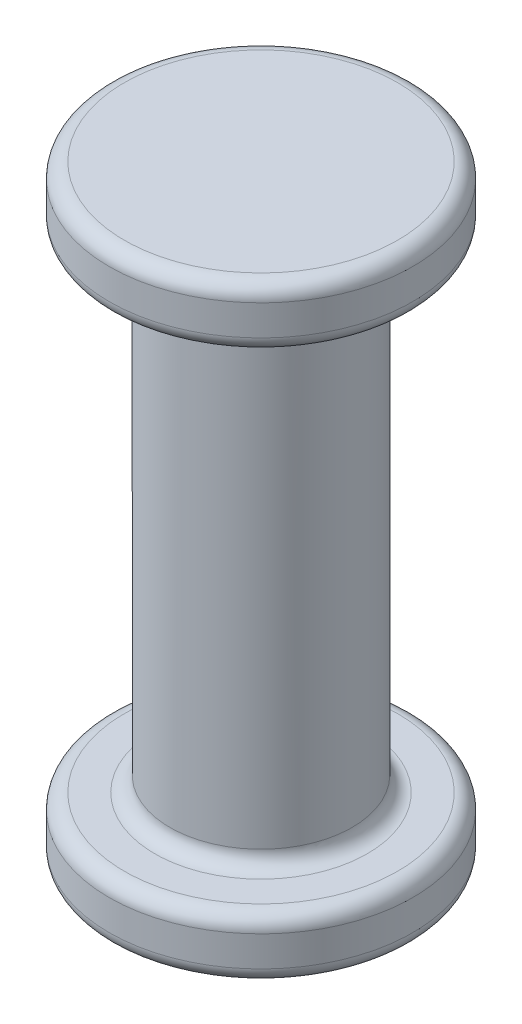
ISO-10303-21;
HEADER;
FILE_DESCRIPTION(('STEP AP214'),'2;1');
FILE_NAME('part.step','',(''),(''),'','','');
FILE_SCHEMA(('AUTOMOTIVE_DESIGN { 1 0 10303 214 1 1 1 1 }'));
ENDSEC;
DATA;
#1=APPLICATION_CONTEXT('core data for automotive mechanical design processes');
#2=APPLICATION_PROTOCOL_DEFINITION('international standard','automotive_design',2000,#1);
#3=PRODUCT_CONTEXT('',#1,'mechanical');
#4=PRODUCT('Part','Part','',(#3));
#5=PRODUCT_RELATED_PRODUCT_CATEGORY('part','',(#4));
#6=PRODUCT_DEFINITION_FORMATION('','',#4);
#7=PRODUCT_DEFINITION_CONTEXT('part definition',#1,'design');
#8=PRODUCT_DEFINITION('design','',#6,#7);
#9=PRODUCT_DEFINITION_SHAPE('','',#8);
#10=(LENGTH_UNIT() NAMED_UNIT(*) SI_UNIT(.MILLI.,.METRE.));
#11=(NAMED_UNIT(*) PLANE_ANGLE_UNIT() SI_UNIT($,.RADIAN.));
#12=(NAMED_UNIT(*) SI_UNIT($,.STERADIAN.) SOLID_ANGLE_UNIT());
#13=UNCERTAINTY_MEASURE_WITH_UNIT(LENGTH_MEASURE(1.E-05),#10,'distance_accuracy_value','');
#14=(GEOMETRIC_REPRESENTATION_CONTEXT(3) GLOBAL_UNCERTAINTY_ASSIGNED_CONTEXT((#13)) GLOBAL_UNIT_ASSIGNED_CONTEXT((#10,
#11,#12)) REPRESENTATION_CONTEXT('',''));
#15=CARTESIAN_POINT('',(0.,0.,0.));
#16=DIRECTION('',(0.,0.,1.));
#17=DIRECTION('',(1.,0.,0.));
#18=AXIS2_PLACEMENT_3D('',#15,#16,#17);
#19=CARTESIAN_POINT('',(0.,0.,0.));
#20=DIRECTION('',(0.,-1.,0.));
#21=DIRECTION('',(0.,0.,-1.));
#22=AXIS2_PLACEMENT_3D('',#19,#20,#21);
#23=CYLINDRICAL_SURFACE('',#22,2.5);
#24=CARTESIAN_POINT('',(0.,0.750000000000001,0.));
#25=DIRECTION('',(0.,-1.,0.));
#26=DIRECTION('',(0.,0.,-1.));
#27=AXIS2_PLACEMENT_3D('',#24,#25,#26);
#28=CIRCLE('',#27,2.5);
#29=CARTESIAN_POINT('',(0.,0.750000000000001,-2.5));
#30=VERTEX_POINT('',#29);
#31=EDGE_CURVE('E44',#30,#30,#28,.T.);
#32=ORIENTED_EDGE('',*,*,#31,.T.);
#33=EDGE_LOOP('',(#32));
#34=FACE_BOUND('',#33,.T.);
#35=CARTESIAN_POINT('',(0.,0.25,0.));
#36=DIRECTION('',(0.,1.,0.));
#37=DIRECTION('',(0.,0.,1.));
#38=AXIS2_PLACEMENT_3D('',#35,#36,#37);
#39=CIRCLE('',#38,2.5);
#40=CARTESIAN_POINT('',(0.,0.25,2.5));
#41=VERTEX_POINT('',#40);
#42=EDGE_CURVE('E48',#41,#41,#39,.T.);
#43=ORIENTED_EDGE('',*,*,#42,.T.);
#44=EDGE_LOOP('',(#43));
#45=FACE_BOUND('',#44,.T.);
#46=ADVANCED_FACE('F37',(#34,#45),#23,.T.);
#47=CARTESIAN_POINT('',(0.,0.,0.));
#48=DIRECTION('',(0.,1.,0.));
#49=DIRECTION('',(0.,0.,1.));
#50=AXIS2_PLACEMENT_3D('',#47,#48,#49);
#51=PLANE('',#50);
#52=CARTESIAN_POINT('',(0.,0.,0.));
#53=DIRECTION('',(0.,1.,0.));
#54=DIRECTION('',(0.,0.,1.));
#55=AXIS2_PLACEMENT_3D('',#52,#53,#54);
#56=CIRCLE('',#55,2.25);
#57=CARTESIAN_POINT('',(0.,0.,2.25));
#58=VERTEX_POINT('',#57);
#59=EDGE_CURVE('E10',#58,#58,#56,.F.);
#60=ORIENTED_EDGE('',*,*,#59,.T.);
#61=EDGE_LOOP('',(#60));
#62=FACE_BOUND('',#61,.T.);
#63=ADVANCED_FACE('F129',(#62),#51,.F.);
#64=CARTESIAN_POINT('',(0.,10.,0.));
#65=DIRECTION('',(0.,-1.,0.));
#66=DIRECTION('',(0.,0.,-1.));
#67=AXIS2_PLACEMENT_3D('',#64,#65,#66);
#68=PLANE('',#67);
#69=CARTESIAN_POINT('',(0.,10.,0.));
#70=DIRECTION('',(0.,-1.,0.));
#71=DIRECTION('',(0.,0.,-1.));
#72=AXIS2_PLACEMENT_3D('',#69,#70,#71);
#73=CIRCLE('',#72,2.25);
#74=CARTESIAN_POINT('',(0.,10.,-2.25));
#75=VERTEX_POINT('',#74);
#76=EDGE_CURVE('E72',#75,#75,#73,.F.);
#77=ORIENTED_EDGE('',*,*,#76,.T.);
#78=EDGE_LOOP('',(#77));
#79=FACE_BOUND('',#78,.T.);
#80=ADVANCED_FACE('F134',(#79),#68,.F.);
#81=CARTESIAN_POINT('',(0.,0.,0.));
#82=DIRECTION('',(0.,-1.,0.));
#83=DIRECTION('',(0.,0.,-1.));
#84=AXIS2_PLACEMENT_3D('',#81,#82,#83);
#85=CYLINDRICAL_SURFACE('',#84,2.5);
#86=CARTESIAN_POINT('',(0.,9.75,0.));
#87=DIRECTION('',(0.,-1.,0.));
#88=DIRECTION('',(0.,0.,-1.));
#89=AXIS2_PLACEMENT_3D('',#86,#87,#88);
#90=CIRCLE('',#89,2.5);
#91=CARTESIAN_POINT('',(0.,9.75,-2.5));
#92=VERTEX_POINT('',#91);
#93=EDGE_CURVE('E75',#92,#92,#90,.T.);
#94=ORIENTED_EDGE('',*,*,#93,.T.);
#95=EDGE_LOOP('',(#94));
#96=FACE_BOUND('',#95,.T.);
#97=CARTESIAN_POINT('',(0.,9.25,0.));
#98=DIRECTION('',(0.,1.,0.));
#99=DIRECTION('',(0.,0.,1.));
#100=AXIS2_PLACEMENT_3D('',#97,#98,#99);
#101=CIRCLE('',#100,2.5);
#102=CARTESIAN_POINT('',(0.,9.25,2.5));
#103=VERTEX_POINT('',#102);
#104=EDGE_CURVE('E78',#103,#103,#101,.T.);
#105=ORIENTED_EDGE('',*,*,#104,.T.);
#106=EDGE_LOOP('',(#105));
#107=FACE_BOUND('',#106,.T.);
#108=ADVANCED_FACE('F82',(#96,#107),#85,.T.);
#109=CARTESIAN_POINT('',(0.,9.,0.));
#110=DIRECTION('',(0.,1.,0.));
#111=DIRECTION('',(0.,0.,1.));
#112=AXIS2_PLACEMENT_3D('',#109,#110,#111);
#113=PLANE('',#112);
#114=CARTESIAN_POINT('',(0.,9.,0.));
#115=DIRECTION('',(0.,1.,0.));
#116=DIRECTION('',(0.,0.,1.));
#117=AXIS2_PLACEMENT_3D('',#114,#115,#116);
#118=CIRCLE('',#117,2.25);
#119=CARTESIAN_POINT('',(0.,9.,2.25));
#120=VERTEX_POINT('',#119);
#121=EDGE_CURVE('E66',#120,#120,#118,.F.);
#122=ORIENTED_EDGE('',*,*,#121,.T.);
#123=EDGE_LOOP('',(#122));
#124=FACE_BOUND('',#123,.T.);
#125=CARTESIAN_POINT('',(0.,9.,0.));
#126=DIRECTION('',(0.,1.,0.));
#127=DIRECTION('',(0.,0.,1.));
#128=AXIS2_PLACEMENT_3D('',#125,#126,#127);
#129=CIRCLE('',#128,1.75);
#130=CARTESIAN_POINT('',(0.,9.,1.75));
#131=VERTEX_POINT('',#130);
#132=EDGE_CURVE('E69',#131,#131,#129,.T.);
#133=ORIENTED_EDGE('',*,*,#132,.T.);
#134=EDGE_LOOP('',(#133));
#135=FACE_BOUND('',#134,.T.);
#136=ADVANCED_FACE('F92',(#124,#135),#113,.F.);
#137=CARTESIAN_POINT('',(0.,0.,0.));
#138=DIRECTION('',(0.,-1.,0.));
#139=DIRECTION('',(0.,0.,-1.));
#140=AXIS2_PLACEMENT_3D('',#137,#138,#139);
#141=CYLINDRICAL_SURFACE('',#140,1.5);
#142=CARTESIAN_POINT('',(0.,8.75,0.));
#143=DIRECTION('',(0.,1.,0.));
#144=DIRECTION('',(0.,0.,1.));
#145=AXIS2_PLACEMENT_3D('',#142,#143,#144);
#146=CIRCLE('',#145,1.5);
#147=CARTESIAN_POINT('',(0.,8.75,1.5));
#148=VERTEX_POINT('',#147);
#149=EDGE_CURVE('E60',#148,#148,#146,.F.);
#150=ORIENTED_EDGE('',*,*,#149,.T.);
#151=EDGE_LOOP('',(#150));
#152=FACE_BOUND('',#151,.T.);
#153=CARTESIAN_POINT('',(0.,1.25,0.));
#154=DIRECTION('',(0.,-1.,0.));
#155=DIRECTION('',(0.,0.,-1.));
#156=AXIS2_PLACEMENT_3D('',#153,#154,#155);
#157=CIRCLE('',#156,1.5);
#158=CARTESIAN_POINT('',(0.,1.25,-1.5));
#159=VERTEX_POINT('',#158);
#160=EDGE_CURVE('E63',#159,#159,#157,.F.);
#161=ORIENTED_EDGE('',*,*,#160,.T.);
#162=EDGE_LOOP('',(#161));
#163=FACE_BOUND('',#162,.T.);
#164=ADVANCED_FACE('F95',(#152,#163),#141,.T.);
#165=CARTESIAN_POINT('',(0.,1.,0.));
#166=DIRECTION('',(0.,-1.,0.));
#167=DIRECTION('',(0.,0.,-1.));
#168=AXIS2_PLACEMENT_3D('',#165,#166,#167);
#169=PLANE('',#168);
#170=CARTESIAN_POINT('',(0.,1.,0.));
#171=DIRECTION('',(0.,-1.,0.));
#172=DIRECTION('',(0.,0.,-1.));
#173=AXIS2_PLACEMENT_3D('',#170,#171,#172);
#174=CIRCLE('',#173,1.75);
#175=CARTESIAN_POINT('',(0.,1.,-1.75));
#176=VERTEX_POINT('',#175);
#177=EDGE_CURVE('E52',#176,#176,#174,.T.);
#178=ORIENTED_EDGE('',*,*,#177,.T.);
#179=EDGE_LOOP('',(#178));
#180=FACE_BOUND('',#179,.T.);
#181=CARTESIAN_POINT('',(0.,1.,0.));
#182=DIRECTION('',(0.,-1.,0.));
#183=DIRECTION('',(0.,0.,-1.));
#184=AXIS2_PLACEMENT_3D('',#181,#182,#183);
#185=CIRCLE('',#184,2.25);
#186=CARTESIAN_POINT('',(0.,1.,-2.25));
#187=VERTEX_POINT('',#186);
#188=EDGE_CURVE('E57',#187,#187,#185,.F.);
#189=ORIENTED_EDGE('',*,*,#188,.T.);
#190=EDGE_LOOP('',(#189));
#191=FACE_BOUND('',#190,.T.);
#192=ADVANCED_FACE('F107',(#180,#191),#169,.F.);
#193=CARTESIAN_POINT('',(0.,9.75,0.));
#194=DIRECTION('',(0.,-1.,0.));
#195=DIRECTION('',(0.,0.,-1.));
#196=AXIS2_PLACEMENT_3D('',#193,#194,#195);
#197=TOROIDAL_SURFACE('',#196,2.25,0.25);
#198=ORIENTED_EDGE('',*,*,#76,.F.);
#199=EDGE_LOOP('',(#198));
#200=FACE_BOUND('',#199,.T.);
#201=ORIENTED_EDGE('',*,*,#93,.F.);
#202=EDGE_LOOP('',(#201));
#203=FACE_BOUND('',#202,.T.);
#204=ADVANCED_FACE('F88',(#200,#203),#197,.T.);
#205=CARTESIAN_POINT('',(0.,9.25,0.));
#206=DIRECTION('',(0.,1.,0.));
#207=DIRECTION('',(0.,0.,1.));
#208=AXIS2_PLACEMENT_3D('',#205,#206,#207);
#209=TOROIDAL_SURFACE('',#208,2.25,0.25);
#210=ORIENTED_EDGE('',*,*,#104,.F.);
#211=EDGE_LOOP('',(#210));
#212=FACE_BOUND('',#211,.T.);
#213=ORIENTED_EDGE('',*,*,#121,.F.);
#214=EDGE_LOOP('',(#213));
#215=FACE_BOUND('',#214,.T.);
#216=ADVANCED_FACE('F84',(#212,#215),#209,.T.);
#217=CARTESIAN_POINT('',(0.,8.75,0.));
#218=DIRECTION('',(0.,1.,0.));
#219=DIRECTION('',(0.,0.,1.));
#220=AXIS2_PLACEMENT_3D('',#217,#218,#219);
#221=TOROIDAL_SURFACE('',#220,1.75,0.25);
#222=ORIENTED_EDGE('',*,*,#132,.F.);
#223=EDGE_LOOP('',(#222));
#224=FACE_BOUND('',#223,.T.);
#225=ORIENTED_EDGE('',*,*,#149,.F.);
#226=EDGE_LOOP('',(#225));
#227=FACE_BOUND('',#226,.T.);
#228=ADVANCED_FACE('F87',(#224,#227),#221,.F.);
#229=CARTESIAN_POINT('',(0.,1.25,0.));
#230=DIRECTION('',(0.,-1.,0.));
#231=DIRECTION('',(0.,0.,-1.));
#232=AXIS2_PLACEMENT_3D('',#229,#230,#231);
#233=TOROIDAL_SURFACE('',#232,1.75,0.25);
#234=ORIENTED_EDGE('',*,*,#160,.F.);
#235=EDGE_LOOP('',(#234));
#236=FACE_BOUND('',#235,.T.);
#237=ORIENTED_EDGE('',*,*,#177,.F.);
#238=EDGE_LOOP('',(#237));
#239=FACE_BOUND('',#238,.T.);
#240=ADVANCED_FACE('F101',(#236,#239),#233,.F.);
#241=CARTESIAN_POINT('',(0.,0.750000000000001,0.));
#242=DIRECTION('',(0.,-1.,0.));
#243=DIRECTION('',(0.,0.,-1.));
#244=AXIS2_PLACEMENT_3D('',#241,#242,#243);
#245=TOROIDAL_SURFACE('',#244,2.25,0.25);
#246=ORIENTED_EDGE('',*,*,#188,.F.);
#247=EDGE_LOOP('',(#246));
#248=FACE_BOUND('',#247,.T.);
#249=ORIENTED_EDGE('',*,*,#31,.F.);
#250=EDGE_LOOP('',(#249));
#251=FACE_BOUND('',#250,.T.);
#252=ADVANCED_FACE('F113',(#248,#251),#245,.T.);
#253=CARTESIAN_POINT('',(0.,0.25,0.));
#254=DIRECTION('',(0.,1.,0.));
#255=DIRECTION('',(0.,0.,1.));
#256=AXIS2_PLACEMENT_3D('',#253,#254,#255);
#257=TOROIDAL_SURFACE('',#256,2.25,0.25);
#258=ORIENTED_EDGE('',*,*,#42,.F.);
#259=EDGE_LOOP('',(#258));
#260=FACE_BOUND('',#259,.T.);
#261=ORIENTED_EDGE('',*,*,#59,.F.);
#262=EDGE_LOOP('',(#261));
#263=FACE_BOUND('',#262,.T.);
#264=ADVANCED_FACE('F39',(#260,#263),#257,.T.);
#265=CLOSED_SHELL('',(#46,#63,#80,#108,#136,#164,#192,#204,#216,#228,#240,#252,#264));
#266=MANIFOLD_SOLID_BREP('B2',#265);
#267=ADVANCED_BREP_SHAPE_REPRESENTATION('',(#18,#266),#14);
#268=SHAPE_DEFINITION_REPRESENTATION(#9,#267);
ENDSEC;
END-ISO-10303-21;
